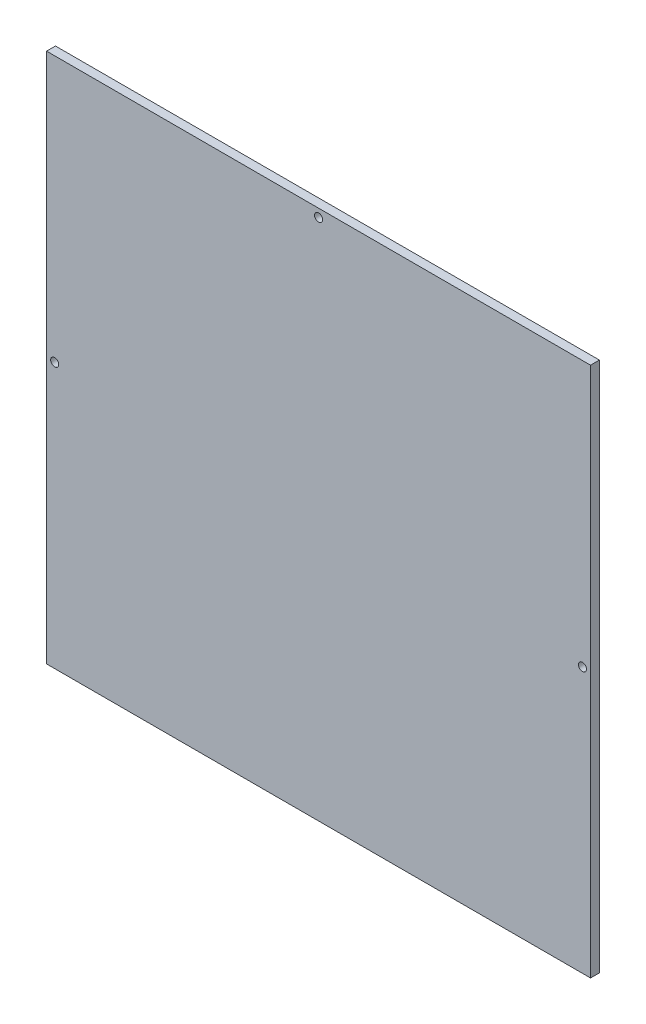
ISO-10303-21;
HEADER;
FILE_DESCRIPTION(('STEP AP214'),'2;1');
FILE_NAME('part.step','',(''),(''),'','','');
FILE_SCHEMA(('AUTOMOTIVE_DESIGN { 1 0 10303 214 1 1 1 1 }'));
ENDSEC;
DATA;
#1=APPLICATION_CONTEXT('core data for automotive mechanical design processes');
#2=APPLICATION_PROTOCOL_DEFINITION('international standard','automotive_design',2000,#1);
#3=PRODUCT_CONTEXT('',#1,'mechanical');
#4=PRODUCT('Part','Part','',(#3));
#5=PRODUCT_RELATED_PRODUCT_CATEGORY('part','',(#4));
#6=PRODUCT_DEFINITION_FORMATION('','',#4);
#7=PRODUCT_DEFINITION_CONTEXT('part definition',#1,'design');
#8=PRODUCT_DEFINITION('design','',#6,#7);
#9=PRODUCT_DEFINITION_SHAPE('','',#8);
#10=(LENGTH_UNIT() NAMED_UNIT(*) SI_UNIT(.MILLI.,.METRE.));
#11=(NAMED_UNIT(*) PLANE_ANGLE_UNIT() SI_UNIT($,.RADIAN.));
#12=(NAMED_UNIT(*) SI_UNIT($,.STERADIAN.) SOLID_ANGLE_UNIT());
#13=UNCERTAINTY_MEASURE_WITH_UNIT(LENGTH_MEASURE(1.E-05),#10,'distance_accuracy_value','');
#14=(GEOMETRIC_REPRESENTATION_CONTEXT(3) GLOBAL_UNCERTAINTY_ASSIGNED_CONTEXT((#13)) GLOBAL_UNIT_ASSIGNED_CONTEXT((#10,
#11,#12)) REPRESENTATION_CONTEXT('',''));
#15=CARTESIAN_POINT('',(0.,0.,0.));
#16=DIRECTION('',(0.,0.,1.));
#17=DIRECTION('',(1.,0.,0.));
#18=AXIS2_PLACEMENT_3D('',#15,#16,#17);
#19=CARTESIAN_POINT('',(0.,0.,3.3));
#20=DIRECTION('',(0.,0.,1.));
#21=DIRECTION('',(1.,0.,0.));
#22=AXIS2_PLACEMENT_3D('',#19,#20,#21);
#23=PLANE('',#22);
#24=CARTESIAN_POINT('',(-98.1,0.,3.3));
#25=DIRECTION('',(0.,0.,1.));
#26=DIRECTION('',(1.,0.,0.));
#27=AXIS2_PLACEMENT_3D('',#24,#25,#26);
#28=CIRCLE('',#27,1.5);
#29=CARTESIAN_POINT('',(-96.6,0.,3.3));
#30=VERTEX_POINT('',#29);
#31=EDGE_CURVE('E125',#30,#30,#28,.T.);
#32=ORIENTED_EDGE('',*,*,#31,.F.);
#33=EDGE_LOOP('',(#32));
#34=FACE_BOUND('',#33,.T.);
#35=DIRECTION('',(0.,1.,0.));
#36=VECTOR('',#35,1.);
#37=CARTESIAN_POINT('',(101.1,98.64,3.3));
#38=LINE('',#37,#36);
#39=CARTESIAN_POINT('',(101.1,-98.64,3.3));
#40=VERTEX_POINT('',#39);
#41=CARTESIAN_POINT('',(101.1,98.64,3.3));
#42=VERTEX_POINT('',#41);
#43=EDGE_CURVE('E95',#40,#42,#38,.T.);
#44=ORIENTED_EDGE('',*,*,#43,.T.);
#45=DIRECTION('',(-1.,0.,0.));
#46=VECTOR('',#45,1.);
#47=CARTESIAN_POINT('',(-101.1,98.64,3.3));
#48=LINE('',#47,#46);
#49=CARTESIAN_POINT('',(-101.1,98.64,3.3));
#50=VERTEX_POINT('',#49);
#51=EDGE_CURVE('E90',#42,#50,#48,.T.);
#52=ORIENTED_EDGE('',*,*,#51,.T.);
#53=DIRECTION('',(0.,-1.,0.));
#54=VECTOR('',#53,1.);
#55=CARTESIAN_POINT('',(-101.1,98.64,3.3));
#56=LINE('',#55,#54);
#57=CARTESIAN_POINT('',(-101.1,-98.64,3.3));
#58=VERTEX_POINT('',#57);
#59=EDGE_CURVE('E93',#50,#58,#56,.T.);
#60=ORIENTED_EDGE('',*,*,#59,.T.);
#61=DIRECTION('',(1.,0.,0.));
#62=VECTOR('',#61,1.);
#63=CARTESIAN_POINT('',(-101.1,-98.64,3.3));
#64=LINE('',#63,#62);
#65=EDGE_CURVE('E60',#58,#40,#64,.T.);
#66=ORIENTED_EDGE('',*,*,#65,.T.);
#67=EDGE_LOOP('',(#44,#52,#60,#66));
#68=FACE_BOUND('',#67,.T.);
#69=CARTESIAN_POINT('',(0.,95.64,3.3));
#70=DIRECTION('',(0.,0.,1.));
#71=DIRECTION('',(1.,0.,0.));
#72=AXIS2_PLACEMENT_3D('',#69,#70,#71);
#73=CIRCLE('',#72,1.5);
#74=CARTESIAN_POINT('',(1.5,95.64,3.3));
#75=VERTEX_POINT('',#74);
#76=EDGE_CURVE('E110',#75,#75,#73,.T.);
#77=ORIENTED_EDGE('',*,*,#76,.F.);
#78=EDGE_LOOP('',(#77));
#79=FACE_BOUND('',#78,.T.);
#80=CARTESIAN_POINT('',(98.1,0.,3.3));
#81=DIRECTION('',(0.,0.,1.));
#82=DIRECTION('',(-1.,0.,0.));
#83=AXIS2_PLACEMENT_3D('',#80,#81,#82);
#84=CIRCLE('',#83,1.5);
#85=CARTESIAN_POINT('',(96.6,0.,3.3));
#86=VERTEX_POINT('',#85);
#87=EDGE_CURVE('E131',#86,#86,#84,.T.);
#88=ORIENTED_EDGE('',*,*,#87,.F.);
#89=EDGE_LOOP('',(#88));
#90=FACE_BOUND('',#89,.T.);
#91=ADVANCED_FACE('F43',(#34,#68,#79,#90),#23,.T.);
#92=CARTESIAN_POINT('',(0.,0.,0.));
#93=DIRECTION('',(0.,0.,1.));
#94=DIRECTION('',(1.,0.,0.));
#95=AXIS2_PLACEMENT_3D('',#92,#93,#94);
#96=PLANE('',#95);
#97=DIRECTION('',(0.,1.,0.));
#98=VECTOR('',#97,1.);
#99=CARTESIAN_POINT('',(101.1,98.64,0.));
#100=LINE('',#99,#98);
#101=CARTESIAN_POINT('',(101.1,-98.64,0.));
#102=VERTEX_POINT('',#101);
#103=CARTESIAN_POINT('',(101.1,98.64,0.));
#104=VERTEX_POINT('',#103);
#105=EDGE_CURVE('E107',#102,#104,#100,.T.);
#106=ORIENTED_EDGE('',*,*,#105,.F.);
#107=DIRECTION('',(1.,0.,0.));
#108=VECTOR('',#107,1.);
#109=CARTESIAN_POINT('',(-101.1,-98.64,0.));
#110=LINE('',#109,#108);
#111=CARTESIAN_POINT('',(-101.1,-98.64,0.));
#112=VERTEX_POINT('',#111);
#113=EDGE_CURVE('E83',#112,#102,#110,.T.);
#114=ORIENTED_EDGE('',*,*,#113,.F.);
#115=DIRECTION('',(0.,-1.,0.));
#116=VECTOR('',#115,1.);
#117=CARTESIAN_POINT('',(-101.1,98.64,0.));
#118=LINE('',#117,#116);
#119=CARTESIAN_POINT('',(-101.1,98.64,0.));
#120=VERTEX_POINT('',#119);
#121=EDGE_CURVE('E77',#120,#112,#118,.T.);
#122=ORIENTED_EDGE('',*,*,#121,.F.);
#123=DIRECTION('',(-1.,0.,0.));
#124=VECTOR('',#123,1.);
#125=CARTESIAN_POINT('',(-101.1,98.64,0.));
#126=LINE('',#125,#124);
#127=EDGE_CURVE('E99',#104,#120,#126,.T.);
#128=ORIENTED_EDGE('',*,*,#127,.F.);
#129=EDGE_LOOP('',(#106,#114,#122,#128));
#130=FACE_BOUND('',#129,.T.);
#131=CARTESIAN_POINT('',(0.,95.64,0.));
#132=DIRECTION('',(0.,0.,1.));
#133=DIRECTION('',(1.,0.,0.));
#134=AXIS2_PLACEMENT_3D('',#131,#132,#133);
#135=CIRCLE('',#134,1.5);
#136=CARTESIAN_POINT('',(1.5,95.64,0.));
#137=VERTEX_POINT('',#136);
#138=EDGE_CURVE('E122',#137,#137,#135,.T.);
#139=ORIENTED_EDGE('',*,*,#138,.T.);
#140=EDGE_LOOP('',(#139));
#141=FACE_BOUND('',#140,.T.);
#142=CARTESIAN_POINT('',(-98.1,0.,0.));
#143=DIRECTION('',(0.,0.,1.));
#144=DIRECTION('',(1.,0.,0.));
#145=AXIS2_PLACEMENT_3D('',#142,#143,#144);
#146=CIRCLE('',#145,1.5);
#147=CARTESIAN_POINT('',(-96.6,0.,0.));
#148=VERTEX_POINT('',#147);
#149=EDGE_CURVE('E128',#148,#148,#146,.T.);
#150=ORIENTED_EDGE('',*,*,#149,.T.);
#151=EDGE_LOOP('',(#150));
#152=FACE_BOUND('',#151,.T.);
#153=CARTESIAN_POINT('',(98.1,0.,0.));
#154=DIRECTION('',(0.,0.,1.));
#155=DIRECTION('',(-1.,0.,0.));
#156=AXIS2_PLACEMENT_3D('',#153,#154,#155);
#157=CIRCLE('',#156,1.5);
#158=CARTESIAN_POINT('',(96.6,0.,0.));
#159=VERTEX_POINT('',#158);
#160=EDGE_CURVE('E134',#159,#159,#157,.T.);
#161=ORIENTED_EDGE('',*,*,#160,.T.);
#162=EDGE_LOOP('',(#161));
#163=FACE_BOUND('',#162,.T.);
#164=ADVANCED_FACE('F118',(#130,#141,#152,#163),#96,.F.);
#165=CARTESIAN_POINT('',(101.1,98.64,3.3));
#166=DIRECTION('',(-1.,0.,0.));
#167=DIRECTION('',(0.,0.,1.));
#168=AXIS2_PLACEMENT_3D('',#165,#166,#167);
#169=PLANE('',#168);
#170=ORIENTED_EDGE('',*,*,#105,.T.);
#171=DIRECTION('',(0.,0.,-1.));
#172=VECTOR('',#171,1.);
#173=CARTESIAN_POINT('',(101.1,98.64,3.3));
#174=LINE('',#173,#172);
#175=EDGE_CURVE('E11',#42,#104,#174,.T.);
#176=ORIENTED_EDGE('',*,*,#175,.F.);
#177=ORIENTED_EDGE('',*,*,#43,.F.);
#178=DIRECTION('',(0.,0.,-1.));
#179=VECTOR('',#178,1.);
#180=CARTESIAN_POINT('',(101.1,-98.64,3.3));
#181=LINE('',#180,#179);
#182=EDGE_CURVE('E103',#40,#102,#181,.T.);
#183=ORIENTED_EDGE('',*,*,#182,.T.);
#184=EDGE_LOOP('',(#170,#176,#177,#183));
#185=FACE_BOUND('',#184,.T.);
#186=ADVANCED_FACE('F45',(#185),#169,.F.);
#187=CARTESIAN_POINT('',(-101.1,98.64,3.3));
#188=DIRECTION('',(0.,-1.,0.));
#189=DIRECTION('',(1.,0.,0.));
#190=AXIS2_PLACEMENT_3D('',#187,#188,#189);
#191=PLANE('',#190);
#192=ORIENTED_EDGE('',*,*,#127,.T.);
#193=DIRECTION('',(0.,0.,-1.));
#194=VECTOR('',#193,1.);
#195=CARTESIAN_POINT('',(-101.1,98.64,3.3));
#196=LINE('',#195,#194);
#197=EDGE_CURVE('E52',#50,#120,#196,.T.);
#198=ORIENTED_EDGE('',*,*,#197,.F.);
#199=ORIENTED_EDGE('',*,*,#51,.F.);
#200=ORIENTED_EDGE('',*,*,#175,.T.);
#201=EDGE_LOOP('',(#192,#198,#199,#200));
#202=FACE_BOUND('',#201,.T.);
#203=ADVANCED_FACE('F98',(#202),#191,.F.);
#204=CARTESIAN_POINT('',(-101.1,98.64,3.3));
#205=DIRECTION('',(1.,0.,0.));
#206=DIRECTION('',(0.,0.,-1.));
#207=AXIS2_PLACEMENT_3D('',#204,#205,#206);
#208=PLANE('',#207);
#209=ORIENTED_EDGE('',*,*,#121,.T.);
#210=DIRECTION('',(0.,0.,-1.));
#211=VECTOR('',#210,1.);
#212=CARTESIAN_POINT('',(-101.1,-98.64,3.3));
#213=LINE('',#212,#211);
#214=EDGE_CURVE('E100',#58,#112,#213,.T.);
#215=ORIENTED_EDGE('',*,*,#214,.F.);
#216=ORIENTED_EDGE('',*,*,#59,.F.);
#217=ORIENTED_EDGE('',*,*,#197,.T.);
#218=EDGE_LOOP('',(#209,#215,#216,#217));
#219=FACE_BOUND('',#218,.T.);
#220=ADVANCED_FACE('F101',(#219),#208,.F.);
#221=CARTESIAN_POINT('',(-101.1,-98.64,3.3));
#222=DIRECTION('',(0.,1.,0.));
#223=DIRECTION('',(0.,0.,1.));
#224=AXIS2_PLACEMENT_3D('',#221,#222,#223);
#225=PLANE('',#224);
#226=ORIENTED_EDGE('',*,*,#113,.T.);
#227=ORIENTED_EDGE('',*,*,#182,.F.);
#228=ORIENTED_EDGE('',*,*,#65,.F.);
#229=ORIENTED_EDGE('',*,*,#214,.T.);
#230=EDGE_LOOP('',(#226,#227,#228,#229));
#231=FACE_BOUND('',#230,.T.);
#232=ADVANCED_FACE('F115',(#231),#225,.F.);
#233=CARTESIAN_POINT('',(0.,95.64,3.3));
#234=DIRECTION('',(0.,0.,-1.));
#235=DIRECTION('',(-1.,0.,0.));
#236=AXIS2_PLACEMENT_3D('',#233,#234,#235);
#237=CYLINDRICAL_SURFACE('',#236,1.5);
#238=ORIENTED_EDGE('',*,*,#76,.T.);
#239=EDGE_LOOP('',(#238));
#240=FACE_BOUND('',#239,.T.);
#241=ORIENTED_EDGE('',*,*,#138,.F.);
#242=EDGE_LOOP('',(#241));
#243=FACE_BOUND('',#242,.T.);
#244=ADVANCED_FACE('F152',(#240,#243),#237,.F.);
#245=CARTESIAN_POINT('',(-98.1,0.,3.3));
#246=DIRECTION('',(0.,0.,-1.));
#247=DIRECTION('',(-1.,0.,0.));
#248=AXIS2_PLACEMENT_3D('',#245,#246,#247);
#249=CYLINDRICAL_SURFACE('',#248,1.5);
#250=ORIENTED_EDGE('',*,*,#31,.T.);
#251=EDGE_LOOP('',(#250));
#252=FACE_BOUND('',#251,.T.);
#253=ORIENTED_EDGE('',*,*,#149,.F.);
#254=EDGE_LOOP('',(#253));
#255=FACE_BOUND('',#254,.T.);
#256=ADVANCED_FACE('F197',(#252,#255),#249,.F.);
#257=CARTESIAN_POINT('',(98.1,0.,3.3));
#258=DIRECTION('',(0.,0.,-1.));
#259=DIRECTION('',(-1.,0.,0.));
#260=AXIS2_PLACEMENT_3D('',#257,#258,#259);
#261=CYLINDRICAL_SURFACE('',#260,1.5);
#262=ORIENTED_EDGE('',*,*,#87,.T.);
#263=EDGE_LOOP('',(#262));
#264=FACE_BOUND('',#263,.T.);
#265=ORIENTED_EDGE('',*,*,#160,.F.);
#266=EDGE_LOOP('',(#265));
#267=FACE_BOUND('',#266,.T.);
#268=ADVANCED_FACE('F140',(#264,#267),#261,.F.);
#269=CLOSED_SHELL('',(#91,#164,#186,#203,#220,#232,#244,#256,#268));
#270=MANIFOLD_SOLID_BREP('B2',#269);
#271=ADVANCED_BREP_SHAPE_REPRESENTATION('',(#18,#270),#14);
#272=SHAPE_DEFINITION_REPRESENTATION(#9,#271);
ENDSEC;
END-ISO-10303-21;
